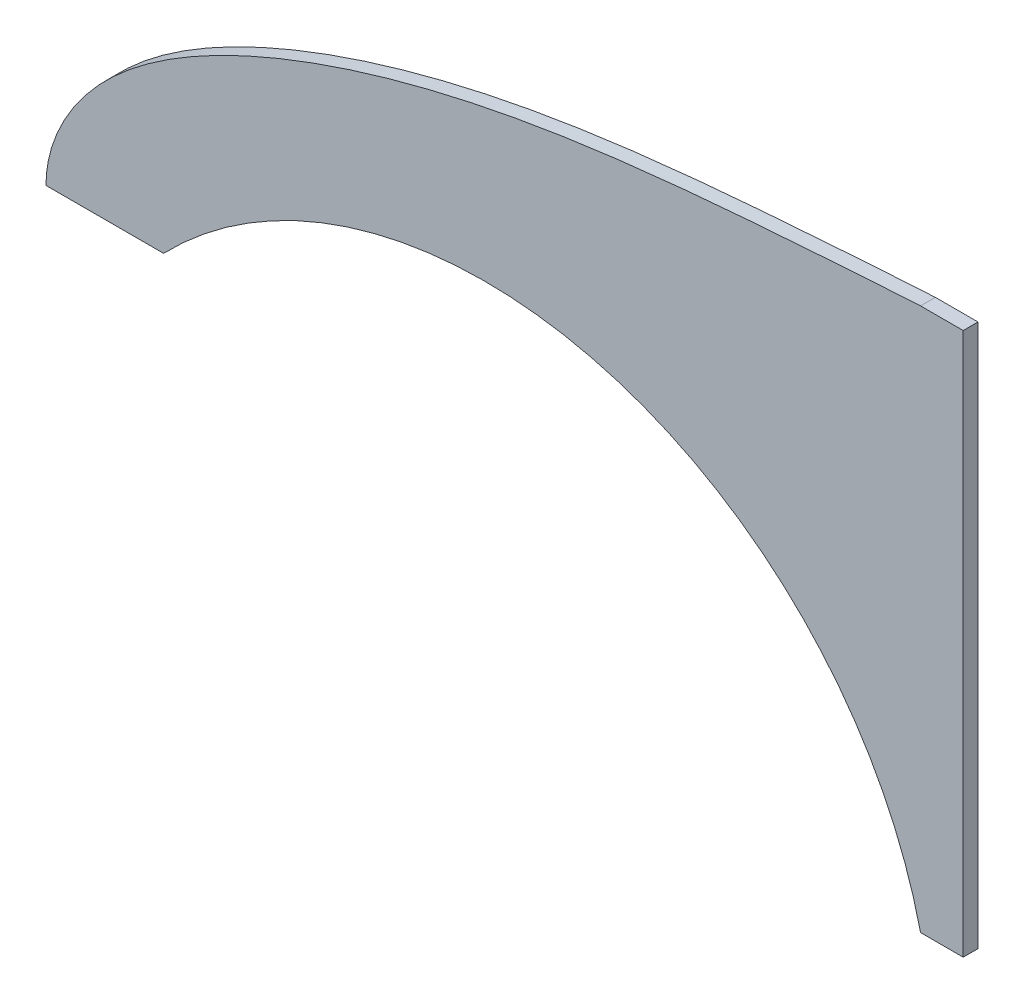
ISO-10303-21;
HEADER;
FILE_DESCRIPTION(('STEP AP214'),'2;1');
FILE_NAME('part.step','',(''),(''),'','','');
FILE_SCHEMA(('AUTOMOTIVE_DESIGN { 1 0 10303 214 1 1 1 1 }'));
ENDSEC;
DATA;
#1=APPLICATION_CONTEXT('core data for automotive mechanical design processes');
#2=APPLICATION_PROTOCOL_DEFINITION('international standard','automotive_design',2000,#1);
#3=PRODUCT_CONTEXT('',#1,'mechanical');
#4=PRODUCT('Part','Part','',(#3));
#5=PRODUCT_RELATED_PRODUCT_CATEGORY('part','',(#4));
#6=PRODUCT_DEFINITION_FORMATION('','',#4);
#7=PRODUCT_DEFINITION_CONTEXT('part definition',#1,'design');
#8=PRODUCT_DEFINITION('design','',#6,#7);
#9=PRODUCT_DEFINITION_SHAPE('','',#8);
#10=(LENGTH_UNIT() NAMED_UNIT(*) SI_UNIT(.MILLI.,.METRE.));
#11=(NAMED_UNIT(*) PLANE_ANGLE_UNIT() SI_UNIT($,.RADIAN.));
#12=(NAMED_UNIT(*) SI_UNIT($,.STERADIAN.) SOLID_ANGLE_UNIT());
#13=UNCERTAINTY_MEASURE_WITH_UNIT(LENGTH_MEASURE(1.E-05),#10,'distance_accuracy_value','');
#14=(GEOMETRIC_REPRESENTATION_CONTEXT(3) GLOBAL_UNCERTAINTY_ASSIGNED_CONTEXT((#13)) GLOBAL_UNIT_ASSIGNED_CONTEXT((#10,
#11,#12)) REPRESENTATION_CONTEXT('',''));
#15=CARTESIAN_POINT('',(0.,0.,0.));
#16=DIRECTION('',(0.,0.,1.));
#17=DIRECTION('',(1.,0.,0.));
#18=AXIS2_PLACEMENT_3D('',#15,#16,#17);
#19=CARTESIAN_POINT('',(-174.094476469176,209.114812278959,12.));
#20=CARTESIAN_POINT('',(-247.107018985387,205.782796091118,12.));
#21=CARTESIAN_POINT('',(-383.342942308012,192.547416477363,12.));
#22=CARTESIAN_POINT('',(-484.262711862893,192.547416477363,12.));
#23=CARTESIAN_POINT('',(-586.836903869495,176.00319196017,12.));
#24=CARTESIAN_POINT('',(-699.337630586412,136.297053118905,12.));
#25=CARTESIAN_POINT('',(-787.856529004961,94.9364918259203,12.));
#26=CARTESIAN_POINT('',(-835.523154152031,65.1568876949717,12.));
#27=CARTESIAN_POINT('',(-869.743143113507,7.25210188479369,12.));
#28=CARTESIAN_POINT('',(-883.1897792991,-27.4907696013132,12.));
#29=CARTESIAN_POINT('',(-883.1897792991,-60.8851877210486,12.));
#30=B_SPLINE_CURVE_WITH_KNOTS('',10,(#19,#20,#21,#22,#23,#24,#25,#26,#27,#28,#29),.UNSPECIFIED.,
.F.,.F.,(11,11),(0.,1.),.UNSPECIFIED.);
#31=DIRECTION('',(0.,0.,-1.));
#32=VECTOR('',#31,1.);
#33=SURFACE_OF_LINEAR_EXTRUSION('',#30,#32);
#34=CARTESIAN_POINT('',(-174.094476469176,209.114812278959,0.));
#35=CARTESIAN_POINT('',(-247.107018985387,205.782796091118,0.));
#36=CARTESIAN_POINT('',(-383.342942308012,192.547416477363,0.));
#37=CARTESIAN_POINT('',(-484.262711862893,192.547416477363,0.));
#38=CARTESIAN_POINT('',(-586.836903869495,176.00319196017,0.));
#39=CARTESIAN_POINT('',(-699.337630586412,136.297053118905,0.));
#40=CARTESIAN_POINT('',(-787.856529004961,94.9364918259203,0.));
#41=CARTESIAN_POINT('',(-835.523154152031,65.1568876949717,0.));
#42=CARTESIAN_POINT('',(-869.743143113507,7.25210188479369,0.));
#43=CARTESIAN_POINT('',(-883.1897792991,-27.4907696013132,0.));
#44=CARTESIAN_POINT('',(-883.1897792991,-60.8851877210486,0.));
#45=B_SPLINE_CURVE_WITH_KNOTS('',10,(#34,#35,#36,#37,#38,#39,#40,#41,#42,#43,#44),.UNSPECIFIED.,
.F.,.F.,(11,11),(0.,1.),.UNSPECIFIED.);
#46=CARTESIAN_POINT('',(-174.094476469176,209.114812278959,0.));
#47=VERTEX_POINT('',#46);
#48=CARTESIAN_POINT('',(-883.1897792991,-60.8851877210486,0.));
#49=VERTEX_POINT('',#48);
#50=EDGE_CURVE('E117',#47,#49,#45,.T.);
#51=ORIENTED_EDGE('',*,*,#50,.T.);
#52=DIRECTION('',(0.,0.,-1.));
#53=VECTOR('',#52,1.);
#54=CARTESIAN_POINT('',(-883.1897792991,-60.8851877210486,12.));
#55=LINE('',#54,#53);
#56=CARTESIAN_POINT('',(-883.1897792991,-60.8851877210486,12.));
#57=VERTEX_POINT('',#56);
#58=EDGE_CURVE('E11',#57,#49,#55,.T.);
#59=ORIENTED_EDGE('',*,*,#58,.F.);
#60=CARTESIAN_POINT('',(-174.094476469176,209.114812278959,12.));
#61=VERTEX_POINT('',#60);
#62=EDGE_CURVE('E132',#61,#57,#30,.T.);
#63=ORIENTED_EDGE('',*,*,#62,.F.);
#64=DIRECTION('',(0.,0.,-1.));
#65=VECTOR('',#64,1.);
#66=CARTESIAN_POINT('',(-174.094476469176,209.114812278959,12.));
#67=LINE('',#66,#65);
#68=EDGE_CURVE('E113',#61,#47,#67,.T.);
#69=ORIENTED_EDGE('',*,*,#68,.T.);
#70=EDGE_LOOP('',(#51,#59,#63,#69));
#71=FACE_BOUND('',#70,.T.);
#72=ADVANCED_FACE('F32',(#71),#33,.F.);
#73=CARTESIAN_POINT('',(-883.1897792991,-60.8851877210486,12.));
#74=DIRECTION('',(0.,1.,0.));
#75=DIRECTION('',(0.,0.,1.));
#76=AXIS2_PLACEMENT_3D('',#73,#74,#75);
#77=PLANE('',#76);
#78=DIRECTION('',(1.,0.,0.));
#79=VECTOR('',#78,1.);
#80=CARTESIAN_POINT('',(-883.1897792991,-60.8851877210486,0.));
#81=LINE('',#80,#79);
#82=CARTESIAN_POINT('',(-787.856529004961,-60.8851877210488,0.));
#83=VERTEX_POINT('',#82);
#84=EDGE_CURVE('E122',#49,#83,#81,.T.);
#85=ORIENTED_EDGE('',*,*,#84,.T.);
#86=DIRECTION('',(0.,0.,-1.));
#87=VECTOR('',#86,1.);
#88=CARTESIAN_POINT('',(-787.856529004961,-60.8851877210488,12.));
#89=LINE('',#88,#87);
#90=CARTESIAN_POINT('',(-787.856529004961,-60.8851877210488,12.));
#91=VERTEX_POINT('',#90);
#92=EDGE_CURVE('E41',#91,#83,#89,.T.);
#93=ORIENTED_EDGE('',*,*,#92,.F.);
#94=DIRECTION('',(1.,0.,0.));
#95=VECTOR('',#94,1.);
#96=CARTESIAN_POINT('',(-883.1897792991,-60.8851877210486,12.));
#97=LINE('',#96,#95);
#98=EDGE_CURVE('E86',#57,#91,#97,.T.);
#99=ORIENTED_EDGE('',*,*,#98,.F.);
#100=ORIENTED_EDGE('',*,*,#58,.T.);
#101=EDGE_LOOP('',(#85,#93,#99,#100));
#102=FACE_BOUND('',#101,.T.);
#103=ADVANCED_FACE('F156',(#102),#77,.F.);
#104=CARTESIAN_POINT('',(-527.157381980521,-312.587594077797,12.));
#105=DIRECTION('',(0.,0.,-1.));
#106=DIRECTION('',(-1.,0.,0.));
#107=AXIS2_PLACEMENT_3D('',#104,#105,#106);
#108=CYLINDRICAL_SURFACE('',#107,362.37845772762);
#109=CARTESIAN_POINT('',(-527.157381980521,-312.587594077797,0.));
#110=DIRECTION('',(0.,0.,-1.));
#111=DIRECTION('',(1.,0.,0.));
#112=AXIS2_PLACEMENT_3D('',#109,#110,#111);
#113=CIRCLE('',#112,362.37845772762);
#114=CARTESIAN_POINT('',(-174.094476469176,-230.949788026096,0.));
#115=VERTEX_POINT('',#114);
#116=EDGE_CURVE('E127',#83,#115,#113,.T.);
#117=ORIENTED_EDGE('',*,*,#116,.T.);
#118=DIRECTION('',(0.,0.,-1.));
#119=VECTOR('',#118,1.);
#120=CARTESIAN_POINT('',(-174.094476469176,-230.949788026096,12.));
#121=LINE('',#120,#119);
#122=CARTESIAN_POINT('',(-174.094476469176,-230.949788026096,12.));
#123=VERTEX_POINT('',#122);
#124=EDGE_CURVE('E108',#123,#115,#121,.T.);
#125=ORIENTED_EDGE('',*,*,#124,.F.);
#126=CARTESIAN_POINT('',(-527.157381980521,-312.587594077797,12.));
#127=DIRECTION('',(0.,0.,-1.));
#128=DIRECTION('',(1.,0.,0.));
#129=AXIS2_PLACEMENT_3D('',#126,#127,#128);
#130=CIRCLE('',#129,362.37845772762);
#131=EDGE_CURVE('E99',#91,#123,#130,.T.);
#132=ORIENTED_EDGE('',*,*,#131,.F.);
#133=ORIENTED_EDGE('',*,*,#92,.T.);
#134=EDGE_LOOP('',(#117,#125,#132,#133));
#135=FACE_BOUND('',#134,.T.);
#136=ADVANCED_FACE('F138',(#135),#108,.F.);
#137=CARTESIAN_POINT('',(-139.506799948984,-230.949788026096,12.));
#138=DIRECTION('',(0.,1.,0.));
#139=DIRECTION('',(0.,0.,1.));
#140=AXIS2_PLACEMENT_3D('',#137,#138,#139);
#141=PLANE('',#140);
#142=DIRECTION('',(1.,0.,0.));
#143=VECTOR('',#142,1.);
#144=CARTESIAN_POINT('',(-139.506799948984,-230.949788026096,0.));
#145=LINE('',#144,#143);
#146=CARTESIAN_POINT('',(-139.506799948984,-230.949788026096,0.));
#147=VERTEX_POINT('',#146);
#148=EDGE_CURVE('E107',#115,#147,#145,.T.);
#149=ORIENTED_EDGE('',*,*,#148,.T.);
#150=DIRECTION('',(0.,0.,-1.));
#151=VECTOR('',#150,1.);
#152=CARTESIAN_POINT('',(-139.506799948984,-230.949788026096,12.));
#153=LINE('',#152,#151);
#154=CARTESIAN_POINT('',(-139.506799948984,-230.949788026096,12.));
#155=VERTEX_POINT('',#154);
#156=EDGE_CURVE('E104',#155,#147,#153,.T.);
#157=ORIENTED_EDGE('',*,*,#156,.F.);
#158=DIRECTION('',(1.,0.,0.));
#159=VECTOR('',#158,1.);
#160=CARTESIAN_POINT('',(-139.506799948984,-230.949788026096,12.));
#161=LINE('',#160,#159);
#162=EDGE_CURVE('E93',#123,#155,#161,.T.);
#163=ORIENTED_EDGE('',*,*,#162,.F.);
#164=ORIENTED_EDGE('',*,*,#124,.T.);
#165=EDGE_LOOP('',(#149,#157,#163,#164));
#166=FACE_BOUND('',#165,.T.);
#167=ADVANCED_FACE('F105',(#166),#141,.F.);
#168=CARTESIAN_POINT('',(-139.506799948984,209.114812278959,12.));
#169=DIRECTION('',(-1.,0.,0.));
#170=DIRECTION('',(0.,0.,1.));
#171=AXIS2_PLACEMENT_3D('',#168,#169,#170);
#172=PLANE('',#171);
#173=DIRECTION('',(0.,1.,0.));
#174=VECTOR('',#173,1.);
#175=CARTESIAN_POINT('',(-139.506799948984,209.114812278959,0.));
#176=LINE('',#175,#174);
#177=CARTESIAN_POINT('',(-139.506799948984,209.114812278959,0.));
#178=VERTEX_POINT('',#177);
#179=EDGE_CURVE('E72',#147,#178,#176,.T.);
#180=ORIENTED_EDGE('',*,*,#179,.T.);
#181=DIRECTION('',(0.,0.,-1.));
#182=VECTOR('',#181,1.);
#183=CARTESIAN_POINT('',(-139.506799948984,209.114812278959,12.));
#184=LINE('',#183,#182);
#185=CARTESIAN_POINT('',(-139.506799948984,209.114812278959,12.));
#186=VERTEX_POINT('',#185);
#187=EDGE_CURVE('E109',#186,#178,#184,.T.);
#188=ORIENTED_EDGE('',*,*,#187,.F.);
#189=DIRECTION('',(0.,1.,0.));
#190=VECTOR('',#189,1.);
#191=CARTESIAN_POINT('',(-139.506799948984,209.114812278959,12.));
#192=LINE('',#191,#190);
#193=EDGE_CURVE('E97',#155,#186,#192,.T.);
#194=ORIENTED_EDGE('',*,*,#193,.F.);
#195=ORIENTED_EDGE('',*,*,#156,.T.);
#196=EDGE_LOOP('',(#180,#188,#194,#195));
#197=FACE_BOUND('',#196,.T.);
#198=ADVANCED_FACE('F111',(#197),#172,.F.);
#199=CARTESIAN_POINT('',(-174.094476469176,209.114812278959,12.));
#200=DIRECTION('',(0.,-1.,0.));
#201=DIRECTION('',(0.,0.,-1.));
#202=AXIS2_PLACEMENT_3D('',#199,#200,#201);
#203=PLANE('',#202);
#204=DIRECTION('',(-1.,0.,0.));
#205=VECTOR('',#204,1.);
#206=CARTESIAN_POINT('',(-174.094476469176,209.114812278959,0.));
#207=LINE('',#206,#205);
#208=EDGE_CURVE('E78',#178,#47,#207,.T.);
#209=ORIENTED_EDGE('',*,*,#208,.T.);
#210=ORIENTED_EDGE('',*,*,#68,.F.);
#211=DIRECTION('',(-1.,0.,0.));
#212=VECTOR('',#211,1.);
#213=CARTESIAN_POINT('',(-174.094476469176,209.114812278959,12.));
#214=LINE('',#213,#212);
#215=EDGE_CURVE('E49',#186,#61,#214,.T.);
#216=ORIENTED_EDGE('',*,*,#215,.F.);
#217=ORIENTED_EDGE('',*,*,#187,.T.);
#218=EDGE_LOOP('',(#209,#210,#216,#217));
#219=FACE_BOUND('',#218,.T.);
#220=ADVANCED_FACE('F145',(#219),#203,.F.);
#221=CARTESIAN_POINT('',(-675.822396304476,129.971519235816,12.));
#222=DIRECTION('',(0.,0.,1.));
#223=DIRECTION('',(1.,0.,0.));
#224=AXIS2_PLACEMENT_3D('',#221,#222,#223);
#225=PLANE('',#224);
#226=ORIENTED_EDGE('',*,*,#62,.T.);
#227=ORIENTED_EDGE('',*,*,#98,.T.);
#228=ORIENTED_EDGE('',*,*,#131,.T.);
#229=ORIENTED_EDGE('',*,*,#162,.T.);
#230=ORIENTED_EDGE('',*,*,#193,.T.);
#231=ORIENTED_EDGE('',*,*,#215,.T.);
#232=EDGE_LOOP('',(#226,#227,#228,#229,#230,#231));
#233=FACE_BOUND('',#232,.T.);
#234=ADVANCED_FACE('F95',(#233),#225,.T.);
#235=CARTESIAN_POINT('',(-675.822396304476,129.971519235816,0.));
#236=DIRECTION('',(0.,0.,1.));
#237=DIRECTION('',(1.,0.,0.));
#238=AXIS2_PLACEMENT_3D('',#235,#236,#237);
#239=PLANE('',#238);
#240=ORIENTED_EDGE('',*,*,#50,.F.);
#241=ORIENTED_EDGE('',*,*,#208,.F.);
#242=ORIENTED_EDGE('',*,*,#179,.F.);
#243=ORIENTED_EDGE('',*,*,#148,.F.);
#244=ORIENTED_EDGE('',*,*,#116,.F.);
#245=ORIENTED_EDGE('',*,*,#84,.F.);
#246=EDGE_LOOP('',(#240,#241,#242,#243,#244,#245));
#247=FACE_BOUND('',#246,.T.);
#248=ADVANCED_FACE('F141',(#247),#239,.F.);
#249=CLOSED_SHELL('',(#72,#103,#136,#167,#198,#220,#234,#248));
#250=MANIFOLD_SOLID_BREP('B2',#249);
#251=ADVANCED_BREP_SHAPE_REPRESENTATION('',(#18,#250),#14);
#252=SHAPE_DEFINITION_REPRESENTATION(#9,#251);
ENDSEC;
END-ISO-10303-21;
